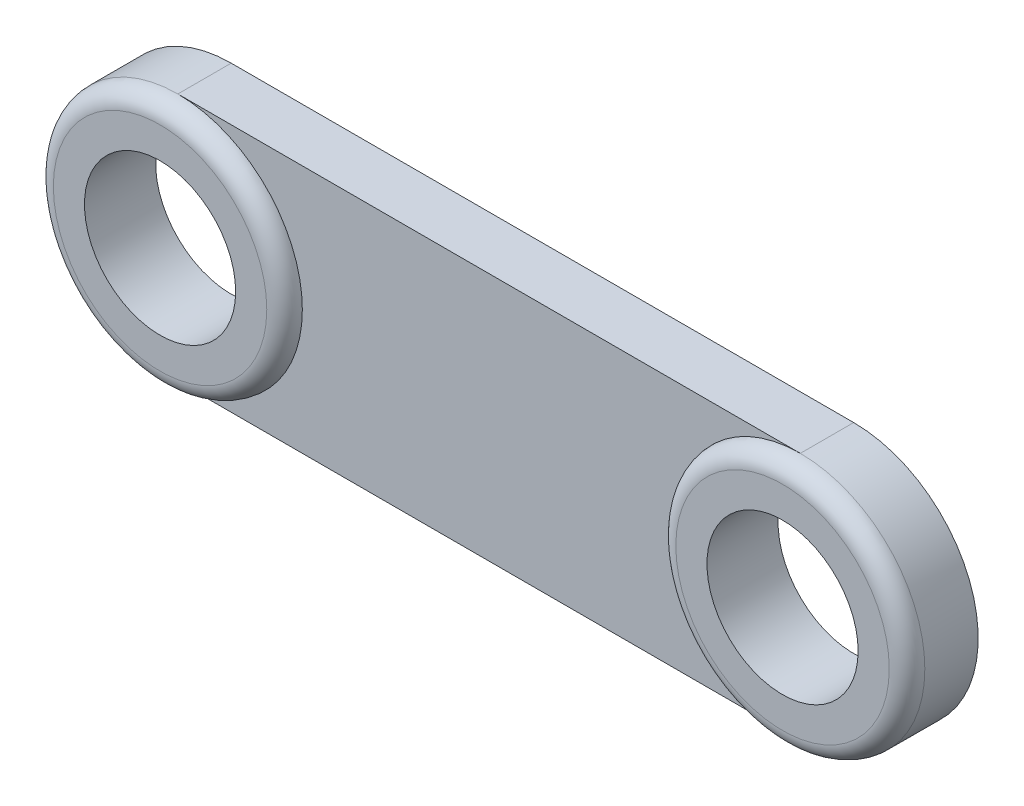
ISO-10303-21;
HEADER;
FILE_DESCRIPTION(('STEP AP214'),'2;1');
FILE_NAME('part.step','',(''),(''),'','','');
FILE_SCHEMA(('AUTOMOTIVE_DESIGN { 1 0 10303 214 1 1 1 1 }'));
ENDSEC;
DATA;
#1=APPLICATION_CONTEXT('core data for automotive mechanical design processes');
#2=APPLICATION_PROTOCOL_DEFINITION('international standard','automotive_design',2000,#1);
#3=PRODUCT_CONTEXT('',#1,'mechanical');
#4=PRODUCT('Part','Part','',(#3));
#5=PRODUCT_RELATED_PRODUCT_CATEGORY('part','',(#4));
#6=PRODUCT_DEFINITION_FORMATION('','',#4);
#7=PRODUCT_DEFINITION_CONTEXT('part definition',#1,'design');
#8=PRODUCT_DEFINITION('design','',#6,#7);
#9=PRODUCT_DEFINITION_SHAPE('','',#8);
#10=(LENGTH_UNIT() NAMED_UNIT(*) SI_UNIT(.MILLI.,.METRE.));
#11=(NAMED_UNIT(*) PLANE_ANGLE_UNIT() SI_UNIT($,.RADIAN.));
#12=(NAMED_UNIT(*) SI_UNIT($,.STERADIAN.) SOLID_ANGLE_UNIT());
#13=UNCERTAINTY_MEASURE_WITH_UNIT(LENGTH_MEASURE(1.E-05),#10,'distance_accuracy_value','');
#14=(GEOMETRIC_REPRESENTATION_CONTEXT(3) GLOBAL_UNCERTAINTY_ASSIGNED_CONTEXT((#13)) GLOBAL_UNIT_ASSIGNED_CONTEXT((#10,
#11,#12)) REPRESENTATION_CONTEXT('',''));
#15=CARTESIAN_POINT('',(0.,0.,0.));
#16=DIRECTION('',(0.,0.,1.));
#17=DIRECTION('',(1.,0.,0.));
#18=AXIS2_PLACEMENT_3D('',#15,#16,#17);
#19=CARTESIAN_POINT('',(-20.,-14.5,3.));
#20=DIRECTION('',(0.,0.,1.));
#21=DIRECTION('',(1.,0.,0.));
#22=AXIS2_PLACEMENT_3D('',#19,#20,#21);
#23=PLANE('',#22);
#24=CARTESIAN_POINT('',(9.,-26.5,3.));
#25=DIRECTION('',(0.,0.,1.));
#26=DIRECTION('',(1.,0.,0.));
#27=AXIS2_PLACEMENT_3D('',#24,#25,#26);
#28=CIRCLE('',#27,7.);
#29=CARTESIAN_POINT('',(9.,-19.5,3.));
#30=VERTEX_POINT('',#29);
#31=CARTESIAN_POINT('',(9.,-33.5,3.));
#32=VERTEX_POINT('',#31);
#33=EDGE_CURVE('E162',#30,#32,#28,.T.);
#34=ORIENTED_EDGE('',*,*,#33,.F.);
#35=DIRECTION('',(-1.,0.,0.));
#36=VECTOR('',#35,1.);
#37=CARTESIAN_POINT('',(-26.,-19.5,3.));
#38=LINE('',#37,#36);
#39=CARTESIAN_POINT('',(-26.,-19.5,3.));
#40=VERTEX_POINT('',#39);
#41=EDGE_CURVE('E48',#30,#40,#38,.T.);
#42=ORIENTED_EDGE('',*,*,#41,.T.);
#43=CARTESIAN_POINT('',(-26.,-26.5,3.));
#44=DIRECTION('',(0.,0.,1.));
#45=DIRECTION('',(1.,0.,0.));
#46=AXIS2_PLACEMENT_3D('',#43,#44,#45);
#47=CIRCLE('',#46,7.);
#48=CARTESIAN_POINT('',(-26.,-33.5,3.));
#49=VERTEX_POINT('',#48);
#50=EDGE_CURVE('E103',#49,#40,#47,.T.);
#51=ORIENTED_EDGE('',*,*,#50,.F.);
#52=DIRECTION('',(1.,0.,0.));
#53=VECTOR('',#52,1.);
#54=CARTESIAN_POINT('',(9.,-33.5,3.));
#55=LINE('',#54,#53);
#56=EDGE_CURVE('E89',#49,#32,#55,.T.);
#57=ORIENTED_EDGE('',*,*,#56,.T.);
#58=EDGE_LOOP('',(#34,#42,#51,#57));
#59=FACE_BOUND('',#58,.T.);
#60=ADVANCED_FACE('F33',(#59),#23,.T.);
#61=CARTESIAN_POINT('',(-20.,-14.5,0.));
#62=DIRECTION('',(0.,0.,1.));
#63=DIRECTION('',(1.,0.,0.));
#64=AXIS2_PLACEMENT_3D('',#61,#62,#63);
#65=PLANE('',#64);
#66=DIRECTION('',(-1.,0.,0.));
#67=VECTOR('',#66,1.);
#68=CARTESIAN_POINT('',(-26.,-19.5,0.));
#69=LINE('',#68,#67);
#70=CARTESIAN_POINT('',(9.,-19.5,0.));
#71=VERTEX_POINT('',#70);
#72=CARTESIAN_POINT('',(-26.,-19.5,0.));
#73=VERTEX_POINT('',#72);
#74=EDGE_CURVE('E94',#71,#73,#69,.T.);
#75=ORIENTED_EDGE('',*,*,#74,.F.);
#76=CARTESIAN_POINT('',(9.,-26.5,0.));
#77=DIRECTION('',(0.,0.,1.));
#78=DIRECTION('',(1.,0.,0.));
#79=AXIS2_PLACEMENT_3D('',#76,#77,#78);
#80=CIRCLE('',#79,7.);
#81=CARTESIAN_POINT('',(9.,-33.5,0.));
#82=VERTEX_POINT('',#81);
#83=EDGE_CURVE('E83',#82,#71,#80,.T.);
#84=ORIENTED_EDGE('',*,*,#83,.F.);
#85=DIRECTION('',(1.,0.,0.));
#86=VECTOR('',#85,1.);
#87=CARTESIAN_POINT('',(9.,-33.5,0.));
#88=LINE('',#87,#86);
#89=CARTESIAN_POINT('',(-26.,-33.5,0.));
#90=VERTEX_POINT('',#89);
#91=EDGE_CURVE('E74',#90,#82,#88,.T.);
#92=ORIENTED_EDGE('',*,*,#91,.F.);
#93=CARTESIAN_POINT('',(-26.,-26.5,0.));
#94=DIRECTION('',(0.,0.,1.));
#95=DIRECTION('',(1.,0.,0.));
#96=AXIS2_PLACEMENT_3D('',#93,#94,#95);
#97=CIRCLE('',#96,7.);
#98=EDGE_CURVE('E84',#73,#90,#97,.T.);
#99=ORIENTED_EDGE('',*,*,#98,.F.);
#100=EDGE_LOOP('',(#75,#84,#92,#99));
#101=FACE_BOUND('',#100,.T.);
#102=CARTESIAN_POINT('',(9.,-26.5,0.));
#103=DIRECTION('',(0.,0.,1.));
#104=DIRECTION('',(1.,0.,0.));
#105=AXIS2_PLACEMENT_3D('',#102,#103,#104);
#106=CIRCLE('',#105,4.25);
#107=CARTESIAN_POINT('',(13.25,-26.5,0.));
#108=VERTEX_POINT('',#107);
#109=EDGE_CURVE('E146',#108,#108,#106,.T.);
#110=ORIENTED_EDGE('',*,*,#109,.T.);
#111=EDGE_LOOP('',(#110));
#112=FACE_BOUND('',#111,.T.);
#113=CARTESIAN_POINT('',(-26.,-26.5,0.));
#114=DIRECTION('',(0.,0.,1.));
#115=DIRECTION('',(1.,0.,0.));
#116=AXIS2_PLACEMENT_3D('',#113,#114,#115);
#117=CIRCLE('',#116,4.25);
#118=CARTESIAN_POINT('',(-21.75,-26.5,0.));
#119=VERTEX_POINT('',#118);
#120=EDGE_CURVE('E154',#119,#119,#117,.T.);
#121=ORIENTED_EDGE('',*,*,#120,.T.);
#122=EDGE_LOOP('',(#121));
#123=FACE_BOUND('',#122,.T.);
#124=ADVANCED_FACE('F92',(#101,#112,#123),#65,.F.);
#125=CARTESIAN_POINT('',(-26.,-19.5,3.));
#126=DIRECTION('',(0.,-1.,0.));
#127=DIRECTION('',(0.,0.,-1.));
#128=AXIS2_PLACEMENT_3D('',#125,#126,#127);
#129=PLANE('',#128);
#130=ORIENTED_EDGE('',*,*,#74,.T.);
#131=DIRECTION('',(0.,0.,-1.));
#132=VECTOR('',#131,1.);
#133=CARTESIAN_POINT('',(-26.,-19.5,3.));
#134=LINE('',#133,#132);
#135=EDGE_CURVE('E100',#40,#73,#134,.T.);
#136=ORIENTED_EDGE('',*,*,#135,.F.);
#137=ORIENTED_EDGE('',*,*,#41,.F.);
#138=DIRECTION('',(0.,0.,1.));
#139=VECTOR('',#138,1.);
#140=CARTESIAN_POINT('',(9.,-19.5,0.));
#141=LINE('',#140,#139);
#142=EDGE_CURVE('E145',#71,#30,#141,.T.);
#143=ORIENTED_EDGE('',*,*,#142,.F.);
#144=EDGE_LOOP('',(#130,#136,#137,#143));
#145=FACE_BOUND('',#144,.T.);
#146=ADVANCED_FACE('F127',(#145),#129,.F.);
#147=CARTESIAN_POINT('',(-26.,-26.5,3.));
#148=DIRECTION('',(0.,0.,-1.));
#149=DIRECTION('',(-1.,0.,0.));
#150=AXIS2_PLACEMENT_3D('',#147,#148,#149);
#151=CYLINDRICAL_SURFACE('',#150,7.);
#152=DIRECTION('',(0.,0.,-1.));
#153=VECTOR('',#152,1.);
#154=CARTESIAN_POINT('',(-26.,-33.5,3.));
#155=LINE('',#154,#153);
#156=EDGE_CURVE('E79',#49,#90,#155,.T.);
#157=ORIENTED_EDGE('',*,*,#156,.F.);
#158=CARTESIAN_POINT('',(-26.,-26.5,3.));
#159=DIRECTION('',(0.,0.,1.));
#160=DIRECTION('',(1.,0.,0.));
#161=AXIS2_PLACEMENT_3D('',#158,#159,#160);
#162=CIRCLE('',#161,7.);
#163=EDGE_CURVE('E11',#49,#40,#162,.F.);
#164=ORIENTED_EDGE('',*,*,#163,.T.);
#165=ORIENTED_EDGE('',*,*,#135,.T.);
#166=ORIENTED_EDGE('',*,*,#98,.T.);
#167=EDGE_LOOP('',(#157,#164,#165,#166));
#168=FACE_BOUND('',#167,.T.);
#169=ADVANCED_FACE('F138',(#168),#151,.T.);
#170=CARTESIAN_POINT('',(9.,-33.5,3.));
#171=DIRECTION('',(0.,1.,0.));
#172=DIRECTION('',(-1.,0.,0.));
#173=AXIS2_PLACEMENT_3D('',#170,#171,#172);
#174=PLANE('',#173);
#175=ORIENTED_EDGE('',*,*,#91,.T.);
#176=DIRECTION('',(0.,0.,-1.));
#177=VECTOR('',#176,1.);
#178=CARTESIAN_POINT('',(9.,-33.5,3.));
#179=LINE('',#178,#177);
#180=EDGE_CURVE('E77',#32,#82,#179,.T.);
#181=ORIENTED_EDGE('',*,*,#180,.F.);
#182=ORIENTED_EDGE('',*,*,#56,.F.);
#183=ORIENTED_EDGE('',*,*,#156,.T.);
#184=EDGE_LOOP('',(#175,#181,#182,#183));
#185=FACE_BOUND('',#184,.T.);
#186=ADVANCED_FACE('F75',(#185),#174,.F.);
#187=CARTESIAN_POINT('',(9.,-26.5,3.));
#188=DIRECTION('',(0.,0.,-1.));
#189=DIRECTION('',(-1.,0.,0.));
#190=AXIS2_PLACEMENT_3D('',#187,#188,#189);
#191=CYLINDRICAL_SURFACE('',#190,7.);
#192=ORIENTED_EDGE('',*,*,#83,.T.);
#193=ORIENTED_EDGE('',*,*,#142,.T.);
#194=EDGE_CURVE('E56',#32,#30,#28,.T.);
#195=ORIENTED_EDGE('',*,*,#194,.F.);
#196=ORIENTED_EDGE('',*,*,#180,.T.);
#197=EDGE_LOOP('',(#192,#193,#195,#196));
#198=FACE_BOUND('',#197,.T.);
#199=ADVANCED_FACE('F87',(#198),#191,.T.);
#200=CARTESIAN_POINT('',(9.,-26.5,3.));
#201=DIRECTION('',(0.,0.,-1.));
#202=DIRECTION('',(-1.,0.,0.));
#203=AXIS2_PLACEMENT_3D('',#200,#201,#202);
#204=CYLINDRICAL_SURFACE('',#203,4.25);
#205=ORIENTED_EDGE('',*,*,#109,.F.);
#206=EDGE_LOOP('',(#205));
#207=FACE_BOUND('',#206,.T.);
#208=CARTESIAN_POINT('',(9.,-26.5,4.));
#209=DIRECTION('',(0.,0.,1.));
#210=DIRECTION('',(1.,0.,0.));
#211=AXIS2_PLACEMENT_3D('',#208,#209,#210);
#212=CIRCLE('',#211,4.25);
#213=CARTESIAN_POINT('',(13.25,-26.5,4.));
#214=VERTEX_POINT('',#213);
#215=EDGE_CURVE('E163',#214,#214,#212,.T.);
#216=ORIENTED_EDGE('',*,*,#215,.T.);
#217=EDGE_LOOP('',(#216));
#218=FACE_BOUND('',#217,.T.);
#219=ADVANCED_FACE('F131',(#207,#218),#204,.F.);
#220=CARTESIAN_POINT('',(-26.,-26.5,3.));
#221=DIRECTION('',(0.,0.,-1.));
#222=DIRECTION('',(-1.,0.,0.));
#223=AXIS2_PLACEMENT_3D('',#220,#221,#222);
#224=CYLINDRICAL_SURFACE('',#223,4.25);
#225=ORIENTED_EDGE('',*,*,#120,.F.);
#226=EDGE_LOOP('',(#225));
#227=FACE_BOUND('',#226,.T.);
#228=CARTESIAN_POINT('',(-26.,-26.5,4.));
#229=DIRECTION('',(0.,0.,1.));
#230=DIRECTION('',(1.,0.,0.));
#231=AXIS2_PLACEMENT_3D('',#228,#229,#230);
#232=CIRCLE('',#231,4.25);
#233=CARTESIAN_POINT('',(-21.75,-26.5,4.));
#234=VERTEX_POINT('',#233);
#235=EDGE_CURVE('E157',#234,#234,#232,.T.);
#236=ORIENTED_EDGE('',*,*,#235,.T.);
#237=EDGE_LOOP('',(#236));
#238=FACE_BOUND('',#237,.T.);
#239=ADVANCED_FACE('F175',(#227,#238),#224,.F.);
#240=CARTESIAN_POINT('',(-26.,-26.5,4.));
#241=DIRECTION('',(0.,0.,1.));
#242=DIRECTION('',(1.,0.,0.));
#243=AXIS2_PLACEMENT_3D('',#240,#241,#242);
#244=PLANE('',#243);
#245=CARTESIAN_POINT('',(-26.,-26.5,4.));
#246=DIRECTION('',(0.,0.,1.));
#247=DIRECTION('',(1.,0.,0.));
#248=AXIS2_PLACEMENT_3D('',#245,#246,#247);
#249=CIRCLE('',#248,6.);
#250=CARTESIAN_POINT('',(-20.,-26.5,4.));
#251=VERTEX_POINT('',#250);
#252=EDGE_CURVE('E41',#251,#251,#249,.T.);
#253=ORIENTED_EDGE('',*,*,#252,.T.);
#254=EDGE_LOOP('',(#253));
#255=FACE_BOUND('',#254,.T.);
#256=ORIENTED_EDGE('',*,*,#235,.F.);
#257=EDGE_LOOP('',(#256));
#258=FACE_BOUND('',#257,.T.);
#259=ADVANCED_FACE('F109',(#255,#258),#244,.T.);
#260=CARTESIAN_POINT('',(9.,-26.5,4.));
#261=DIRECTION('',(0.,0.,1.));
#262=DIRECTION('',(1.,0.,0.));
#263=AXIS2_PLACEMENT_3D('',#260,#261,#262);
#264=PLANE('',#263);
#265=CARTESIAN_POINT('',(9.,-26.5,4.));
#266=DIRECTION('',(0.,0.,1.));
#267=DIRECTION('',(1.,0.,0.));
#268=AXIS2_PLACEMENT_3D('',#265,#266,#267);
#269=CIRCLE('',#268,6.);
#270=CARTESIAN_POINT('',(15.,-26.5,4.));
#271=VERTEX_POINT('',#270);
#272=EDGE_CURVE('E104',#271,#271,#269,.T.);
#273=ORIENTED_EDGE('',*,*,#272,.T.);
#274=EDGE_LOOP('',(#273));
#275=FACE_BOUND('',#274,.T.);
#276=ORIENTED_EDGE('',*,*,#215,.F.);
#277=EDGE_LOOP('',(#276));
#278=FACE_BOUND('',#277,.T.);
#279=ADVANCED_FACE('F118',(#275,#278),#264,.T.);
#280=CARTESIAN_POINT('',(9.,-26.5,3.));
#281=DIRECTION('',(0.,0.,1.));
#282=DIRECTION('',(1.,0.,0.));
#283=AXIS2_PLACEMENT_3D('',#280,#281,#282);
#284=TOROIDAL_SURFACE('',#283,6.,1.);
#285=ORIENTED_EDGE('',*,*,#33,.T.);
#286=ORIENTED_EDGE('',*,*,#194,.T.);
#287=EDGE_LOOP('',(#285,#286));
#288=FACE_BOUND('',#287,.T.);
#289=ORIENTED_EDGE('',*,*,#272,.F.);
#290=EDGE_LOOP('',(#289));
#291=FACE_BOUND('',#290,.T.);
#292=ADVANCED_FACE('F113',(#288,#291),#284,.T.);
#293=CARTESIAN_POINT('',(-26.,-26.5,3.));
#294=DIRECTION('',(0.,0.,1.));
#295=DIRECTION('',(1.,0.,0.));
#296=AXIS2_PLACEMENT_3D('',#293,#294,#295);
#297=TOROIDAL_SURFACE('',#296,6.,1.);
#298=ORIENTED_EDGE('',*,*,#50,.T.);
#299=ORIENTED_EDGE('',*,*,#163,.F.);
#300=EDGE_LOOP('',(#298,#299));
#301=FACE_BOUND('',#300,.T.);
#302=ORIENTED_EDGE('',*,*,#252,.F.);
#303=EDGE_LOOP('',(#302));
#304=FACE_BOUND('',#303,.T.);
#305=ADVANCED_FACE('F35',(#301,#304),#297,.T.);
#306=CLOSED_SHELL('',(#60,#124,#146,#169,#186,#199,#219,#239,#259,#279,#292,#305));
#307=MANIFOLD_SOLID_BREP('B2',#306);
#308=ADVANCED_BREP_SHAPE_REPRESENTATION('',(#18,#307),#14);
#309=SHAPE_DEFINITION_REPRESENTATION(#9,#308);
ENDSEC;
END-ISO-10303-21;
